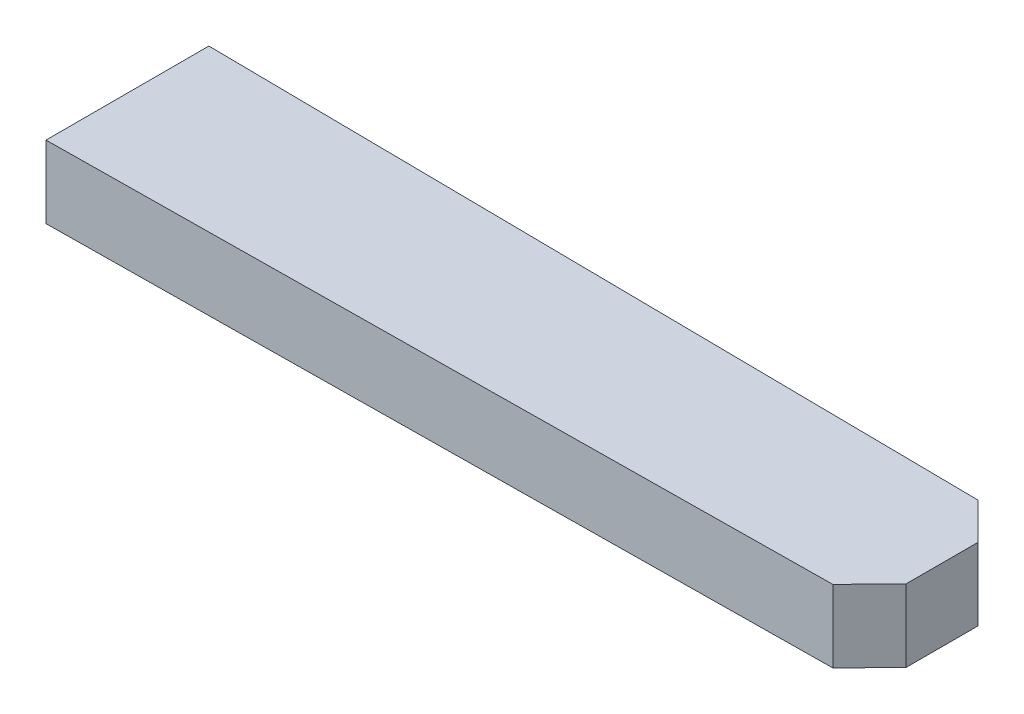
ISO-10303-21;
HEADER;
FILE_DESCRIPTION(('STEP AP214'),'2;1');
FILE_NAME('part.step','',(''),(''),'','','');
FILE_SCHEMA(('AUTOMOTIVE_DESIGN { 1 0 10303 214 1 1 1 1 }'));
ENDSEC;
DATA;
#1=APPLICATION_CONTEXT('core data for automotive mechanical design processes');
#2=APPLICATION_PROTOCOL_DEFINITION('international standard','automotive_design',2000,#1);
#3=PRODUCT_CONTEXT('',#1,'mechanical');
#4=PRODUCT('Part','Part','',(#3));
#5=PRODUCT_RELATED_PRODUCT_CATEGORY('part','',(#4));
#6=PRODUCT_DEFINITION_FORMATION('','',#4);
#7=PRODUCT_DEFINITION_CONTEXT('part definition',#1,'design');
#8=PRODUCT_DEFINITION('design','',#6,#7);
#9=PRODUCT_DEFINITION_SHAPE('','',#8);
#10=(LENGTH_UNIT() NAMED_UNIT(*) SI_UNIT(.MILLI.,.METRE.));
#11=(NAMED_UNIT(*) PLANE_ANGLE_UNIT() SI_UNIT($,.RADIAN.));
#12=(NAMED_UNIT(*) SI_UNIT($,.STERADIAN.) SOLID_ANGLE_UNIT());
#13=UNCERTAINTY_MEASURE_WITH_UNIT(LENGTH_MEASURE(1.E-05),#10,'distance_accuracy_value','');
#14=(GEOMETRIC_REPRESENTATION_CONTEXT(3) GLOBAL_UNCERTAINTY_ASSIGNED_CONTEXT((#13)) GLOBAL_UNIT_ASSIGNED_CONTEXT((#10,
#11,#12)) REPRESENTATION_CONTEXT('',''));
#15=CARTESIAN_POINT('',(0.,0.,0.));
#16=DIRECTION('',(0.,0.,1.));
#17=DIRECTION('',(1.,0.,0.));
#18=AXIS2_PLACEMENT_3D('',#15,#16,#17);
#19=CARTESIAN_POINT('',(0.,4.,-9.));
#20=DIRECTION('',(1.,0.,0.));
#21=DIRECTION('',(0.,0.,-1.));
#22=AXIS2_PLACEMENT_3D('',#19,#20,#21);
#23=PLANE('',#22);
#24=DIRECTION('',(0.,0.,1.));
#25=VECTOR('',#24,1.);
#26=CARTESIAN_POINT('',(0.,0.,-9.));
#27=LINE('',#26,#25);
#28=CARTESIAN_POINT('',(0.,0.,-9.));
#29=VERTEX_POINT('',#28);
#30=CARTESIAN_POINT('',(0.,0.,0.));
#31=VERTEX_POINT('',#30);
#32=EDGE_CURVE('E122',#29,#31,#27,.T.);
#33=ORIENTED_EDGE('',*,*,#32,.T.);
#34=DIRECTION('',(0.,-1.,0.));
#35=VECTOR('',#34,1.);
#36=CARTESIAN_POINT('',(0.,4.,0.));
#37=LINE('',#36,#35);
#38=CARTESIAN_POINT('',(0.,4.,0.));
#39=VERTEX_POINT('',#38);
#40=EDGE_CURVE('E105',#39,#31,#37,.T.);
#41=ORIENTED_EDGE('',*,*,#40,.F.);
#42=DIRECTION('',(0.,0.,1.));
#43=VECTOR('',#42,1.);
#44=CARTESIAN_POINT('',(0.,4.,-9.));
#45=LINE('',#44,#43);
#46=CARTESIAN_POINT('',(0.,4.,-9.));
#47=VERTEX_POINT('',#46);
#48=EDGE_CURVE('E110',#47,#39,#45,.T.);
#49=ORIENTED_EDGE('',*,*,#48,.F.);
#50=DIRECTION('',(0.,-1.,0.));
#51=VECTOR('',#50,1.);
#52=CARTESIAN_POINT('',(0.,4.,-9.));
#53=LINE('',#52,#51);
#54=EDGE_CURVE('E125',#47,#29,#53,.T.);
#55=ORIENTED_EDGE('',*,*,#54,.T.);
#56=EDGE_LOOP('',(#33,#41,#49,#55));
#57=FACE_BOUND('',#56,.T.);
#58=ADVANCED_FACE('F46',(#57),#23,.F.);
#59=CARTESIAN_POINT('',(45.,4.,-0.500000000000009));
#60=DIRECTION('',(-0.0111104253035551,0.,-0.999938277319943));
#61=DIRECTION('',(-0.999938277319943,0.,0.0111104253035551));
#62=AXIS2_PLACEMENT_3D('',#59,#60,#61);
#63=PLANE('',#62);
#64=DIRECTION('',(0.999938277319943,0.,-0.0111104253035551));
#65=VECTOR('',#64,1.);
#66=CARTESIAN_POINT('',(45.,0.,-0.500000000000009));
#67=LINE('',#66,#65);
#68=CARTESIAN_POINT('',(43.0001234453601,0.,-0.477779149392899));
#69=VERTEX_POINT('',#68);
#70=EDGE_CURVE('E163',#31,#69,#67,.T.);
#71=ORIENTED_EDGE('',*,*,#70,.T.);
#72=DIRECTION('',(0.,1.,0.));
#73=VECTOR('',#72,1.);
#74=CARTESIAN_POINT('',(43.0001234453601,4.,-0.477779149392899));
#75=LINE('',#74,#73);
#76=CARTESIAN_POINT('',(43.0001234453601,4.,-0.477779149392899));
#77=VERTEX_POINT('',#76);
#78=EDGE_CURVE('E71',#69,#77,#75,.T.);
#79=ORIENTED_EDGE('',*,*,#78,.T.);
#80=DIRECTION('',(0.999938277319943,0.,-0.0111104253035551));
#81=VECTOR('',#80,1.);
#82=CARTESIAN_POINT('',(45.,4.,-0.500000000000009));
#83=LINE('',#82,#81);
#84=EDGE_CURVE('E101',#39,#77,#83,.T.);
#85=ORIENTED_EDGE('',*,*,#84,.F.);
#86=ORIENTED_EDGE('',*,*,#40,.T.);
#87=EDGE_LOOP('',(#71,#79,#85,#86));
#88=FACE_BOUND('',#87,.T.);
#89=ADVANCED_FACE('F103',(#88),#63,.F.);
#90=CARTESIAN_POINT('',(45.,4.,-8.50000000000001));
#91=DIRECTION('',(-1.,0.,0.));
#92=DIRECTION('',(0.,0.,1.));
#93=AXIS2_PLACEMENT_3D('',#90,#91,#92);
#94=PLANE('',#93);
#95=DIRECTION('',(0.,0.,-1.));
#96=VECTOR('',#95,1.);
#97=CARTESIAN_POINT('',(45.,4.,-8.50000000000001));
#98=LINE('',#97,#96);
#99=CARTESIAN_POINT('',(45.,4.,-2.52259675020448));
#100=VERTEX_POINT('',#99);
#101=CARTESIAN_POINT('',(45.,4.,-6.5));
#102=VERTEX_POINT('',#101);
#103=EDGE_CURVE('E109',#100,#102,#98,.T.);
#104=ORIENTED_EDGE('',*,*,#103,.F.);
#105=DIRECTION('',(0.,-1.,0.));
#106=VECTOR('',#105,1.);
#107=CARTESIAN_POINT('',(45.,4.,-2.52259675020448));
#108=LINE('',#107,#106);
#109=CARTESIAN_POINT('',(45.,0.,-2.52259675020448));
#110=VERTEX_POINT('',#109);
#111=EDGE_CURVE('E130',#100,#110,#108,.T.);
#112=ORIENTED_EDGE('',*,*,#111,.T.);
#113=DIRECTION('',(0.,0.,-1.));
#114=VECTOR('',#113,1.);
#115=CARTESIAN_POINT('',(45.,0.,-8.50000000000001));
#116=LINE('',#115,#114);
#117=CARTESIAN_POINT('',(45.,0.,-6.5));
#118=VERTEX_POINT('',#117);
#119=EDGE_CURVE('E164',#110,#118,#116,.T.);
#120=ORIENTED_EDGE('',*,*,#119,.T.);
#121=DIRECTION('',(0.,1.,0.));
#122=VECTOR('',#121,1.);
#123=CARTESIAN_POINT('',(45.,4.,-6.5));
#124=LINE('',#123,#122);
#125=EDGE_CURVE('E124',#118,#102,#124,.T.);
#126=ORIENTED_EDGE('',*,*,#125,.T.);
#127=EDGE_LOOP('',(#104,#112,#120,#126));
#128=FACE_BOUND('',#127,.T.);
#129=ADVANCED_FACE('F154',(#128),#94,.F.);
#130=CARTESIAN_POINT('',(0.,4.,-9.));
#131=DIRECTION('',(-0.0111104253035547,0.,0.999938277319943));
#132=DIRECTION('',(0.999938277319943,0.,0.0111104253035547));
#133=AXIS2_PLACEMENT_3D('',#130,#131,#132);
#134=PLANE('',#133);
#135=DIRECTION('',(-0.999938277319943,0.,-0.0111104253035547));
#136=VECTOR('',#135,1.);
#137=CARTESIAN_POINT('',(0.,4.,-9.));
#138=LINE('',#137,#136);
#139=CARTESIAN_POINT('',(42.9775280898876,4.,-8.52247191011237));
#140=VERTEX_POINT('',#139);
#141=EDGE_CURVE('E114',#140,#47,#138,.T.);
#142=ORIENTED_EDGE('',*,*,#141,.F.);
#143=DIRECTION('',(0.,-1.,0.));
#144=VECTOR('',#143,1.);
#145=CARTESIAN_POINT('',(42.9775280898876,4.,-8.52247191011237));
#146=LINE('',#145,#144);
#147=CARTESIAN_POINT('',(42.9775280898876,0.,-8.52247191011237));
#148=VERTEX_POINT('',#147);
#149=EDGE_CURVE('E11',#140,#148,#146,.T.);
#150=ORIENTED_EDGE('',*,*,#149,.T.);
#151=DIRECTION('',(-0.999938277319943,0.,-0.0111104253035547));
#152=VECTOR('',#151,1.);
#153=CARTESIAN_POINT('',(0.,0.,-9.));
#154=LINE('',#153,#152);
#155=EDGE_CURVE('E119',#148,#29,#154,.T.);
#156=ORIENTED_EDGE('',*,*,#155,.T.);
#157=ORIENTED_EDGE('',*,*,#54,.F.);
#158=EDGE_LOOP('',(#142,#150,#156,#157));
#159=FACE_BOUND('',#158,.T.);
#160=ADVANCED_FACE('F176',(#159),#134,.F.);
#161=CARTESIAN_POINT('',(0.,4.,0.));
#162=DIRECTION('',(0.,-1.,0.));
#163=DIRECTION('',(0.,0.,-1.));
#164=AXIS2_PLACEMENT_3D('',#161,#162,#163);
#165=PLANE('',#164);
#166=ORIENTED_EDGE('',*,*,#84,.T.);
#167=DIRECTION('',(-0.699206879586917,0.,0.714919393734935));
#168=VECTOR('',#167,1.);
#169=CARTESIAN_POINT('',(45.,4.,-2.52259675020448));
#170=LINE('',#169,#168);
#171=EDGE_CURVE('E56',#77,#100,#170,.F.);
#172=ORIENTED_EDGE('',*,*,#171,.T.);
#173=ORIENTED_EDGE('',*,*,#103,.T.);
#174=DIRECTION('',(0.707106781186545,0.,0.70710678118655));
#175=VECTOR('',#174,1.);
#176=CARTESIAN_POINT('',(42.9775280898876,4.,-8.52247191011237));
#177=LINE('',#176,#175);
#178=EDGE_CURVE('E63',#102,#140,#177,.F.);
#179=ORIENTED_EDGE('',*,*,#178,.T.);
#180=ORIENTED_EDGE('',*,*,#141,.T.);
#181=ORIENTED_EDGE('',*,*,#48,.T.);
#182=EDGE_LOOP('',(#166,#172,#173,#179,#180,#181));
#183=FACE_BOUND('',#182,.T.);
#184=ADVANCED_FACE('F113',(#183),#165,.F.);
#185=CARTESIAN_POINT('',(0.,0.,0.));
#186=DIRECTION('',(0.,-1.,0.));
#187=DIRECTION('',(0.,0.,-1.));
#188=AXIS2_PLACEMENT_3D('',#185,#186,#187);
#189=PLANE('',#188);
#190=ORIENTED_EDGE('',*,*,#119,.F.);
#191=DIRECTION('',(0.699206879586917,0.,-0.714919393734935));
#192=VECTOR('',#191,1.);
#193=CARTESIAN_POINT('',(21.7389512973764,0.,21.2611721479836));
#194=LINE('',#193,#192);
#195=EDGE_CURVE('E142',#110,#69,#194,.F.);
#196=ORIENTED_EDGE('',*,*,#195,.T.);
#197=ORIENTED_EDGE('',*,*,#70,.F.);
#198=ORIENTED_EDGE('',*,*,#32,.F.);
#199=ORIENTED_EDGE('',*,*,#155,.F.);
#200=DIRECTION('',(-0.707106781186545,0.,-0.70710678118655));
#201=VECTOR('',#200,1.);
#202=CARTESIAN_POINT('',(25.7500000000002,0.,-25.75));
#203=LINE('',#202,#201);
#204=EDGE_CURVE('E139',#148,#118,#203,.F.);
#205=ORIENTED_EDGE('',*,*,#204,.T.);
#206=EDGE_LOOP('',(#190,#196,#197,#198,#199,#205));
#207=FACE_BOUND('',#206,.T.);
#208=ADVANCED_FACE('F162',(#207),#189,.T.);
#209=CARTESIAN_POINT('',(45.,4.,-2.52259675020448));
#210=DIRECTION('',(-0.714919393734935,0.,-0.699206879586917));
#211=DIRECTION('',(0.,-1.,0.));
#212=AXIS2_PLACEMENT_3D('',#209,#210,#211);
#213=PLANE('',#212);
#214=ORIENTED_EDGE('',*,*,#171,.F.);
#215=ORIENTED_EDGE('',*,*,#78,.F.);
#216=ORIENTED_EDGE('',*,*,#195,.F.);
#217=ORIENTED_EDGE('',*,*,#111,.F.);
#218=EDGE_LOOP('',(#214,#215,#216,#217));
#219=FACE_BOUND('',#218,.T.);
#220=ADVANCED_FACE('F160',(#219),#213,.F.);
#221=CARTESIAN_POINT('',(42.9775280898876,4.,-8.52247191011237));
#222=DIRECTION('',(-0.70710678118655,0.,0.707106781186545));
#223=DIRECTION('',(0.,-1.,0.));
#224=AXIS2_PLACEMENT_3D('',#221,#222,#223);
#225=PLANE('',#224);
#226=ORIENTED_EDGE('',*,*,#178,.F.);
#227=ORIENTED_EDGE('',*,*,#125,.F.);
#228=ORIENTED_EDGE('',*,*,#204,.F.);
#229=ORIENTED_EDGE('',*,*,#149,.F.);
#230=EDGE_LOOP('',(#226,#227,#228,#229));
#231=FACE_BOUND('',#230,.T.);
#232=ADVANCED_FACE('F49',(#231),#225,.F.);
#233=CLOSED_SHELL('',(#58,#89,#129,#160,#184,#208,#220,#232));
#234=MANIFOLD_SOLID_BREP('B2',#233);
#235=ADVANCED_BREP_SHAPE_REPRESENTATION('',(#18,#234),#14);
#236=SHAPE_DEFINITION_REPRESENTATION(#9,#235);
ENDSEC;
END-ISO-10303-21;
